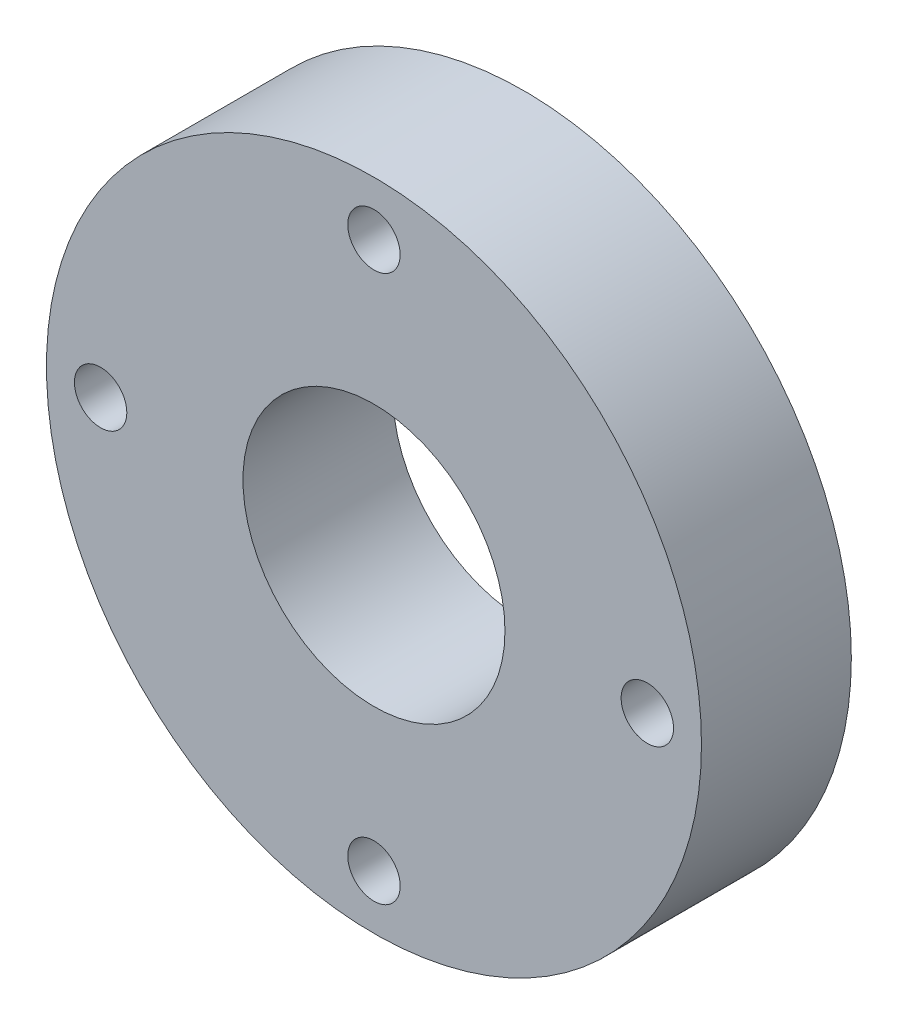
ISO-10303-21;
HEADER;
FILE_DESCRIPTION(('STEP AP214'),'2;1');
FILE_NAME('part.step','',(''),(''),'','','');
FILE_SCHEMA(('AUTOMOTIVE_DESIGN { 1 0 10303 214 1 1 1 1 }'));
ENDSEC;
DATA;
#1=APPLICATION_CONTEXT('core data for automotive mechanical design processes');
#2=APPLICATION_PROTOCOL_DEFINITION('international standard','automotive_design',2000,#1);
#3=PRODUCT_CONTEXT('',#1,'mechanical');
#4=PRODUCT('Part','Part','',(#3));
#5=PRODUCT_RELATED_PRODUCT_CATEGORY('part','',(#4));
#6=PRODUCT_DEFINITION_FORMATION('','',#4);
#7=PRODUCT_DEFINITION_CONTEXT('part definition',#1,'design');
#8=PRODUCT_DEFINITION('design','',#6,#7);
#9=PRODUCT_DEFINITION_SHAPE('','',#8);
#10=(LENGTH_UNIT() NAMED_UNIT(*) SI_UNIT(.MILLI.,.METRE.));
#11=(NAMED_UNIT(*) PLANE_ANGLE_UNIT() SI_UNIT($,.RADIAN.));
#12=(NAMED_UNIT(*) SI_UNIT($,.STERADIAN.) SOLID_ANGLE_UNIT());
#13=UNCERTAINTY_MEASURE_WITH_UNIT(LENGTH_MEASURE(1.E-05),#10,'distance_accuracy_value','');
#14=(GEOMETRIC_REPRESENTATION_CONTEXT(3) GLOBAL_UNCERTAINTY_ASSIGNED_CONTEXT((#13)) GLOBAL_UNIT_ASSIGNED_CONTEXT((#10,
#11,#12)) REPRESENTATION_CONTEXT('',''));
#15=CARTESIAN_POINT('',(0.,0.,0.));
#16=DIRECTION('',(0.,0.,1.));
#17=DIRECTION('',(1.,0.,0.));
#18=AXIS2_PLACEMENT_3D('',#15,#16,#17);
#19=CARTESIAN_POINT('',(0.,0.,57.2));
#20=DIRECTION('',(0.,0.,1.));
#21=DIRECTION('',(1.,0.,0.));
#22=AXIS2_PLACEMENT_3D('',#19,#20,#21);
#23=PLANE('',#22);
#24=CARTESIAN_POINT('',(-104.32919769954,0.,57.2));
#25=DIRECTION('',(0.,0.,1.));
#26=DIRECTION('',(1.,0.,0.));
#27=AXIS2_PLACEMENT_3D('',#24,#25,#26);
#28=CIRCLE('',#27,9.99999999999999);
#29=CARTESIAN_POINT('',(-94.32919769954,0.,57.2));
#30=VERTEX_POINT('',#29);
#31=EDGE_CURVE('E68',#30,#30,#28,.T.);
#32=ORIENTED_EDGE('',*,*,#31,.F.);
#33=EDGE_LOOP('',(#32));
#34=FACE_BOUND('',#33,.T.);
#35=CARTESIAN_POINT('',(3.6426344686442E-13,104.32919769954,57.2));
#36=DIRECTION('',(0.,0.,1.));
#37=DIRECTION('',(1.,0.,0.));
#38=AXIS2_PLACEMENT_3D('',#35,#36,#37);
#39=CIRCLE('',#38,10.);
#40=CARTESIAN_POINT('',(10.0000000000004,104.32919769954,57.2));
#41=VERTEX_POINT('',#40);
#42=EDGE_CURVE('E62',#41,#41,#39,.T.);
#43=ORIENTED_EDGE('',*,*,#42,.F.);
#44=EDGE_LOOP('',(#43));
#45=FACE_BOUND('',#44,.T.);
#46=CARTESIAN_POINT('',(104.32919769954,-7.2852689372884E-13,57.2));
#47=DIRECTION('',(0.,0.,1.));
#48=DIRECTION('',(1.,0.,0.));
#49=AXIS2_PLACEMENT_3D('',#46,#47,#48);
#50=CIRCLE('',#49,9.99999999999999);
#51=CARTESIAN_POINT('',(114.32919769954,-7.2852689372884E-13,57.2));
#52=VERTEX_POINT('',#51);
#53=EDGE_CURVE('E56',#52,#52,#50,.T.);
#54=ORIENTED_EDGE('',*,*,#53,.F.);
#55=EDGE_LOOP('',(#54));
#56=FACE_BOUND('',#55,.T.);
#57=CARTESIAN_POINT('',(-1.09279034059326E-12,-104.32919769954,57.2));
#58=DIRECTION('',(0.,0.,1.));
#59=DIRECTION('',(1.,0.,0.));
#60=AXIS2_PLACEMENT_3D('',#57,#58,#59);
#61=CIRCLE('',#60,9.99999999999999);
#62=CARTESIAN_POINT('',(9.9999999999989,-104.32919769954,57.2));
#63=VERTEX_POINT('',#62);
#64=EDGE_CURVE('E50',#63,#63,#61,.T.);
#65=ORIENTED_EDGE('',*,*,#64,.F.);
#66=EDGE_LOOP('',(#65));
#67=FACE_BOUND('',#66,.T.);
#68=CARTESIAN_POINT('',(0.,0.,57.2));
#69=DIRECTION('',(0.,0.,1.));
#70=DIRECTION('',(1.,0.,0.));
#71=AXIS2_PLACEMENT_3D('',#68,#69,#70);
#72=CIRCLE('',#71,125.);
#73=CARTESIAN_POINT('',(125.,0.,57.2));
#74=VERTEX_POINT('',#73);
#75=EDGE_CURVE('E10',#74,#74,#72,.T.);
#76=ORIENTED_EDGE('',*,*,#75,.T.);
#77=EDGE_LOOP('',(#76));
#78=FACE_BOUND('',#77,.T.);
#79=CARTESIAN_POINT('',(0.,0.,57.2));
#80=DIRECTION('',(0.,0.,1.));
#81=DIRECTION('',(1.,0.,0.));
#82=AXIS2_PLACEMENT_3D('',#79,#80,#81);
#83=CIRCLE('',#82,50.);
#84=CARTESIAN_POINT('',(50.,0.,57.2));
#85=VERTEX_POINT('',#84);
#86=EDGE_CURVE('E42',#85,#85,#83,.T.);
#87=ORIENTED_EDGE('',*,*,#86,.F.);
#88=EDGE_LOOP('',(#87));
#89=FACE_BOUND('',#88,.T.);
#90=ADVANCED_FACE('F31',(#34,#45,#56,#67,#78,#89),#23,.T.);
#91=CARTESIAN_POINT('',(0.,0.,0.));
#92=DIRECTION('',(0.,0.,1.));
#93=DIRECTION('',(1.,0.,0.));
#94=AXIS2_PLACEMENT_3D('',#91,#92,#93);
#95=PLANE('',#94);
#96=CARTESIAN_POINT('',(-104.32919769954,0.,0.));
#97=DIRECTION('',(0.,0.,1.));
#98=DIRECTION('',(1.,0.,0.));
#99=AXIS2_PLACEMENT_3D('',#96,#97,#98);
#100=CIRCLE('',#99,9.99999999999999);
#101=CARTESIAN_POINT('',(-94.32919769954,0.,0.));
#102=VERTEX_POINT('',#101);
#103=EDGE_CURVE('E47',#102,#102,#100,.T.);
#104=ORIENTED_EDGE('',*,*,#103,.T.);
#105=EDGE_LOOP('',(#104));
#106=FACE_BOUND('',#105,.T.);
#107=CARTESIAN_POINT('',(3.6426344686442E-13,104.32919769954,0.));
#108=DIRECTION('',(0.,0.,1.));
#109=DIRECTION('',(1.,0.,0.));
#110=AXIS2_PLACEMENT_3D('',#107,#108,#109);
#111=CIRCLE('',#110,10.);
#112=CARTESIAN_POINT('',(10.0000000000004,104.32919769954,0.));
#113=VERTEX_POINT('',#112);
#114=EDGE_CURVE('E65',#113,#113,#111,.T.);
#115=ORIENTED_EDGE('',*,*,#114,.T.);
#116=EDGE_LOOP('',(#115));
#117=FACE_BOUND('',#116,.T.);
#118=CARTESIAN_POINT('',(104.32919769954,-7.2852689372884E-13,0.));
#119=DIRECTION('',(0.,0.,1.));
#120=DIRECTION('',(1.,0.,0.));
#121=AXIS2_PLACEMENT_3D('',#118,#119,#120);
#122=CIRCLE('',#121,9.99999999999999);
#123=CARTESIAN_POINT('',(114.32919769954,-7.2852689372884E-13,0.));
#124=VERTEX_POINT('',#123);
#125=EDGE_CURVE('E59',#124,#124,#122,.T.);
#126=ORIENTED_EDGE('',*,*,#125,.T.);
#127=EDGE_LOOP('',(#126));
#128=FACE_BOUND('',#127,.T.);
#129=CARTESIAN_POINT('',(-1.09279034059326E-12,-104.32919769954,0.));
#130=DIRECTION('',(0.,0.,1.));
#131=DIRECTION('',(1.,0.,0.));
#132=AXIS2_PLACEMENT_3D('',#129,#130,#131);
#133=CIRCLE('',#132,9.99999999999999);
#134=CARTESIAN_POINT('',(9.9999999999989,-104.32919769954,0.));
#135=VERTEX_POINT('',#134);
#136=EDGE_CURVE('E53',#135,#135,#133,.T.);
#137=ORIENTED_EDGE('',*,*,#136,.T.);
#138=EDGE_LOOP('',(#137));
#139=FACE_BOUND('',#138,.T.);
#140=CARTESIAN_POINT('',(0.,0.,0.));
#141=DIRECTION('',(0.,0.,1.));
#142=DIRECTION('',(1.,0.,0.));
#143=AXIS2_PLACEMENT_3D('',#140,#141,#142);
#144=CIRCLE('',#143,125.);
#145=CARTESIAN_POINT('',(125.,0.,0.));
#146=VERTEX_POINT('',#145);
#147=EDGE_CURVE('E35',#146,#146,#144,.T.);
#148=ORIENTED_EDGE('',*,*,#147,.F.);
#149=EDGE_LOOP('',(#148));
#150=FACE_BOUND('',#149,.T.);
#151=CARTESIAN_POINT('',(0.,0.,0.));
#152=DIRECTION('',(0.,0.,1.));
#153=DIRECTION('',(1.,0.,0.));
#154=AXIS2_PLACEMENT_3D('',#151,#152,#153);
#155=CIRCLE('',#154,50.);
#156=CARTESIAN_POINT('',(50.,0.,0.));
#157=VERTEX_POINT('',#156);
#158=EDGE_CURVE('E44',#157,#157,#155,.T.);
#159=ORIENTED_EDGE('',*,*,#158,.T.);
#160=EDGE_LOOP('',(#159));
#161=FACE_BOUND('',#160,.T.);
#162=ADVANCED_FACE('F74',(#106,#117,#128,#139,#150,#161),#95,.F.);
#163=CARTESIAN_POINT('',(0.,0.,57.2));
#164=DIRECTION('',(0.,0.,-1.));
#165=DIRECTION('',(-1.,0.,0.));
#166=AXIS2_PLACEMENT_3D('',#163,#164,#165);
#167=CYLINDRICAL_SURFACE('',#166,125.);
#168=ORIENTED_EDGE('',*,*,#75,.F.);
#169=EDGE_LOOP('',(#168));
#170=FACE_BOUND('',#169,.T.);
#171=ORIENTED_EDGE('',*,*,#147,.T.);
#172=EDGE_LOOP('',(#171));
#173=FACE_BOUND('',#172,.T.);
#174=ADVANCED_FACE('F33',(#170,#173),#167,.T.);
#175=CARTESIAN_POINT('',(0.,0.,57.2));
#176=DIRECTION('',(0.,0.,-1.));
#177=DIRECTION('',(-1.,0.,0.));
#178=AXIS2_PLACEMENT_3D('',#175,#176,#177);
#179=CYLINDRICAL_SURFACE('',#178,50.);
#180=ORIENTED_EDGE('',*,*,#86,.T.);
#181=EDGE_LOOP('',(#180));
#182=FACE_BOUND('',#181,.T.);
#183=ORIENTED_EDGE('',*,*,#158,.F.);
#184=EDGE_LOOP('',(#183));
#185=FACE_BOUND('',#184,.T.);
#186=ADVANCED_FACE('F95',(#182,#185),#179,.F.);
#187=CARTESIAN_POINT('',(-1.09279034059326E-12,-104.32919769954,0.));
#188=DIRECTION('',(0.,0.,1.));
#189=DIRECTION('',(1.,0.,0.));
#190=AXIS2_PLACEMENT_3D('',#187,#188,#189);
#191=CYLINDRICAL_SURFACE('',#190,9.99999999999999);
#192=ORIENTED_EDGE('',*,*,#136,.F.);
#193=EDGE_LOOP('',(#192));
#194=FACE_BOUND('',#193,.T.);
#195=ORIENTED_EDGE('',*,*,#64,.T.);
#196=EDGE_LOOP('',(#195));
#197=FACE_BOUND('',#196,.T.);
#198=ADVANCED_FACE('F98',(#194,#197),#191,.F.);
#199=CARTESIAN_POINT('',(104.32919769954,-7.2852689372884E-13,0.));
#200=DIRECTION('',(0.,0.,1.));
#201=DIRECTION('',(1.,0.,0.));
#202=AXIS2_PLACEMENT_3D('',#199,#200,#201);
#203=CYLINDRICAL_SURFACE('',#202,9.99999999999999);
#204=ORIENTED_EDGE('',*,*,#125,.F.);
#205=EDGE_LOOP('',(#204));
#206=FACE_BOUND('',#205,.T.);
#207=ORIENTED_EDGE('',*,*,#53,.T.);
#208=EDGE_LOOP('',(#207));
#209=FACE_BOUND('',#208,.T.);
#210=ADVANCED_FACE('F110',(#206,#209),#203,.F.);
#211=CARTESIAN_POINT('',(3.6426344686442E-13,104.32919769954,0.));
#212=DIRECTION('',(0.,0.,1.));
#213=DIRECTION('',(1.,0.,0.));
#214=AXIS2_PLACEMENT_3D('',#211,#212,#213);
#215=CYLINDRICAL_SURFACE('',#214,10.);
#216=ORIENTED_EDGE('',*,*,#114,.F.);
#217=EDGE_LOOP('',(#216));
#218=FACE_BOUND('',#217,.T.);
#219=ORIENTED_EDGE('',*,*,#42,.T.);
#220=EDGE_LOOP('',(#219));
#221=FACE_BOUND('',#220,.T.);
#222=ADVANCED_FACE('F80',(#218,#221),#215,.F.);
#223=CARTESIAN_POINT('',(-104.32919769954,0.,0.));
#224=DIRECTION('',(0.,0.,1.));
#225=DIRECTION('',(1.,0.,0.));
#226=AXIS2_PLACEMENT_3D('',#223,#224,#225);
#227=CYLINDRICAL_SURFACE('',#226,9.99999999999999);
#228=ORIENTED_EDGE('',*,*,#103,.F.);
#229=EDGE_LOOP('',(#228));
#230=FACE_BOUND('',#229,.T.);
#231=ORIENTED_EDGE('',*,*,#31,.T.);
#232=EDGE_LOOP('',(#231));
#233=FACE_BOUND('',#232,.T.);
#234=ADVANCED_FACE('F77',(#230,#233),#227,.F.);
#235=CLOSED_SHELL('',(#90,#162,#174,#186,#198,#210,#222,#234));
#236=MANIFOLD_SOLID_BREP('B2',#235);
#237=ADVANCED_BREP_SHAPE_REPRESENTATION('',(#18,#236),#14);
#238=SHAPE_DEFINITION_REPRESENTATION(#9,#237);
ENDSEC;
END-ISO-10303-21;
